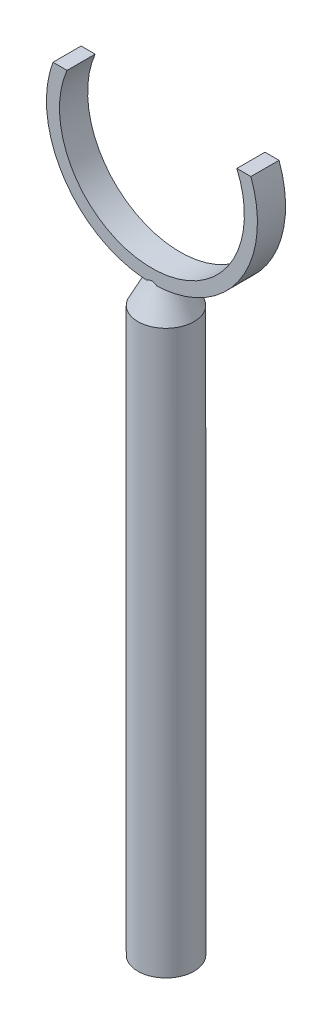
ISO-10303-21;
HEADER;
FILE_DESCRIPTION(('STEP AP214'),'2;1');
FILE_NAME('part.step','',(''),(''),'','','');
FILE_SCHEMA(('AUTOMOTIVE_DESIGN { 1 0 10303 214 1 1 1 1 }'));
ENDSEC;
DATA;
#1=APPLICATION_CONTEXT('core data for automotive mechanical design processes');
#2=APPLICATION_PROTOCOL_DEFINITION('international standard','automotive_design',2000,#1);
#3=PRODUCT_CONTEXT('',#1,'mechanical');
#4=PRODUCT('Part','Part','',(#3));
#5=PRODUCT_RELATED_PRODUCT_CATEGORY('part','',(#4));
#6=PRODUCT_DEFINITION_FORMATION('','',#4);
#7=PRODUCT_DEFINITION_CONTEXT('part definition',#1,'design');
#8=PRODUCT_DEFINITION('design','',#6,#7);
#9=PRODUCT_DEFINITION_SHAPE('','',#8);
#10=(LENGTH_UNIT() NAMED_UNIT(*) SI_UNIT(.MILLI.,.METRE.));
#11=(NAMED_UNIT(*) PLANE_ANGLE_UNIT() SI_UNIT($,.RADIAN.));
#12=(NAMED_UNIT(*) SI_UNIT($,.STERADIAN.) SOLID_ANGLE_UNIT());
#13=UNCERTAINTY_MEASURE_WITH_UNIT(LENGTH_MEASURE(1.E-05),#10,'distance_accuracy_value','');
#14=(GEOMETRIC_REPRESENTATION_CONTEXT(3) GLOBAL_UNCERTAINTY_ASSIGNED_CONTEXT((#13)) GLOBAL_UNIT_ASSIGNED_CONTEXT((#10,
#11,#12)) REPRESENTATION_CONTEXT('',''));
#15=CARTESIAN_POINT('',(0.,0.,0.));
#16=DIRECTION('',(0.,0.,1.));
#17=DIRECTION('',(1.,0.,0.));
#18=AXIS2_PLACEMENT_3D('',#15,#16,#17);
#19=CARTESIAN_POINT('',(0.,246.762097191876,4.99999999999999));
#20=DIRECTION('',(0.,0.,-1.));
#21=DIRECTION('',(-1.,0.,0.));
#22=AXIS2_PLACEMENT_3D('',#19,#20,#21);
#23=CYLINDRICAL_SURFACE('',#22,32.8552966657521);
#24=DIRECTION('',(0.,0.,-1.));
#25=VECTOR('',#24,1.);
#26=CARTESIAN_POINT('',(30.1800492165906,259.748056851399,4.99999999999999));
#27=LINE('',#26,#25);
#28=CARTESIAN_POINT('',(30.1800492165906,259.748056851399,4.99999999999999));
#29=VERTEX_POINT('',#28);
#30=CARTESIAN_POINT('',(30.1800492165906,259.748056851399,-4.99999999999999));
#31=VERTEX_POINT('',#30);
#32=EDGE_CURVE('E56',#29,#31,#27,.T.);
#33=ORIENTED_EDGE('',*,*,#32,.T.);
#34=CARTESIAN_POINT('',(0.,246.762097191876,-4.99999999999999));
#35=DIRECTION('',(0.,0.,1.));
#36=DIRECTION('',(1.,0.,0.));
#37=AXIS2_PLACEMENT_3D('',#34,#35,#36);
#38=CIRCLE('',#37,32.8552966657521);
#39=CARTESIAN_POINT('',(-30.1800492165906,259.748056851399,-4.99999999999999));
#40=VERTEX_POINT('',#39);
#41=EDGE_CURVE('E93',#40,#31,#38,.T.);
#42=ORIENTED_EDGE('',*,*,#41,.F.);
#43=DIRECTION('',(0.,0.,-1.));
#44=VECTOR('',#43,1.);
#45=CARTESIAN_POINT('',(-30.1800492165906,259.748056851399,4.99999999999999));
#46=LINE('',#45,#44);
#47=CARTESIAN_POINT('',(-30.1800492165906,259.748056851399,4.99999999999999));
#48=VERTEX_POINT('',#47);
#49=EDGE_CURVE('E13',#48,#40,#46,.T.);
#50=ORIENTED_EDGE('',*,*,#49,.F.);
#51=CARTESIAN_POINT('',(0.,246.762097191876,4.99999999999999));
#52=DIRECTION('',(0.,0.,1.));
#53=DIRECTION('',(1.,0.,0.));
#54=AXIS2_PLACEMENT_3D('',#51,#52,#53);
#55=CIRCLE('',#54,32.8552966657521);
#56=EDGE_CURVE('E94',#48,#29,#55,.T.);
#57=ORIENTED_EDGE('',*,*,#56,.T.);
#58=EDGE_LOOP('',(#33,#42,#50,#57));
#59=FACE_BOUND('',#58,.T.);
#60=ADVANCED_FACE('F53',(#59),#23,.F.);
#61=CARTESIAN_POINT('',(-35.1800492165906,259.748056851399,4.99999999999999));
#62=DIRECTION('',(0.,1.,0.));
#63=DIRECTION('',(0.,0.,1.));
#64=AXIS2_PLACEMENT_3D('',#61,#62,#63);
#65=PLANE('',#64);
#66=ORIENTED_EDGE('',*,*,#49,.T.);
#67=DIRECTION('',(1.,0.,0.));
#68=VECTOR('',#67,1.);
#69=CARTESIAN_POINT('',(-35.1800492165906,259.748056851399,-4.99999999999999));
#70=LINE('',#69,#68);
#71=CARTESIAN_POINT('',(-35.1800492165906,259.748056851399,-4.99999999999999));
#72=VERTEX_POINT('',#71);
#73=EDGE_CURVE('E111',#72,#40,#70,.T.);
#74=ORIENTED_EDGE('',*,*,#73,.F.);
#75=DIRECTION('',(0.,0.,-1.));
#76=VECTOR('',#75,1.);
#77=CARTESIAN_POINT('',(-35.1800492165906,259.748056851399,4.99999999999999));
#78=LINE('',#77,#76);
#79=CARTESIAN_POINT('',(-35.1800492165906,259.748056851399,4.99999999999999));
#80=VERTEX_POINT('',#79);
#81=EDGE_CURVE('E61',#80,#72,#78,.T.);
#82=ORIENTED_EDGE('',*,*,#81,.F.);
#83=DIRECTION('',(1.,0.,0.));
#84=VECTOR('',#83,1.);
#85=CARTESIAN_POINT('',(-35.1800492165906,259.748056851399,4.99999999999999));
#86=LINE('',#85,#84);
#87=EDGE_CURVE('E99',#80,#48,#86,.T.);
#88=ORIENTED_EDGE('',*,*,#87,.T.);
#89=EDGE_LOOP('',(#66,#74,#82,#88));
#90=FACE_BOUND('',#89,.T.);
#91=ADVANCED_FACE('F125',(#90),#65,.T.);
#92=CARTESIAN_POINT('',(0.,246.762097191876,4.99999999999999));
#93=DIRECTION('',(0.,0.,-1.));
#94=DIRECTION('',(-1.,0.,0.));
#95=AXIS2_PLACEMENT_3D('',#92,#93,#94);
#96=CYLINDRICAL_SURFACE('',#95,37.5002801477601);
#97=ORIENTED_EDGE('',*,*,#81,.T.);
#98=CARTESIAN_POINT('',(0.,246.762097191876,-4.99999999999999));
#99=DIRECTION('',(0.,0.,1.));
#100=DIRECTION('',(1.,0.,0.));
#101=AXIS2_PLACEMENT_3D('',#98,#99,#100);
#102=CIRCLE('',#101,37.5002801477601);
#103=CARTESIAN_POINT('',(35.1800492165906,259.748056851399,-4.99999999999999));
#104=VERTEX_POINT('',#103);
#105=EDGE_CURVE('E107',#72,#104,#102,.T.);
#106=ORIENTED_EDGE('',*,*,#105,.T.);
#107=DIRECTION('',(0.,0.,-1.));
#108=VECTOR('',#107,1.);
#109=CARTESIAN_POINT('',(35.1800492165906,259.748056851399,4.99999999999999));
#110=LINE('',#109,#108);
#111=CARTESIAN_POINT('',(35.1800492165906,259.748056851399,4.99999999999999));
#112=VERTEX_POINT('',#111);
#113=EDGE_CURVE('E98',#112,#104,#110,.T.);
#114=ORIENTED_EDGE('',*,*,#113,.F.);
#115=CARTESIAN_POINT('',(0.,246.762097191876,4.99999999999999));
#116=DIRECTION('',(0.,0.,1.));
#117=DIRECTION('',(1.,0.,0.));
#118=AXIS2_PLACEMENT_3D('',#115,#116,#117);
#119=CIRCLE('',#118,37.5002801477601);
#120=EDGE_CURVE('E119',#80,#112,#119,.T.);
#121=ORIENTED_EDGE('',*,*,#120,.F.);
#122=EDGE_LOOP('',(#97,#106,#114,#121));
#123=FACE_BOUND('',#122,.T.);
#124=ADVANCED_FACE('F123',(#123),#96,.T.);
#125=CARTESIAN_POINT('',(30.1800492165906,259.748056851399,4.99999999999999));
#126=DIRECTION('',(0.,1.,0.));
#127=DIRECTION('',(0.,0.,1.));
#128=AXIS2_PLACEMENT_3D('',#125,#126,#127);
#129=PLANE('',#128);
#130=ORIENTED_EDGE('',*,*,#113,.T.);
#131=DIRECTION('',(1.,0.,0.));
#132=VECTOR('',#131,1.);
#133=CARTESIAN_POINT('',(30.1800492165906,259.748056851399,-4.99999999999999));
#134=LINE('',#133,#132);
#135=EDGE_CURVE('E101',#31,#104,#134,.T.);
#136=ORIENTED_EDGE('',*,*,#135,.F.);
#137=ORIENTED_EDGE('',*,*,#32,.F.);
#138=DIRECTION('',(1.,0.,0.));
#139=VECTOR('',#138,1.);
#140=CARTESIAN_POINT('',(30.1800492165906,259.748056851399,4.99999999999999));
#141=LINE('',#140,#139);
#142=EDGE_CURVE('E117',#29,#112,#141,.T.);
#143=ORIENTED_EDGE('',*,*,#142,.T.);
#144=EDGE_LOOP('',(#130,#136,#137,#143));
#145=FACE_BOUND('',#144,.T.);
#146=ADVANCED_FACE('F102',(#145),#129,.T.);
#147=CARTESIAN_POINT('',(0.,246.762097191876,4.99999999999999));
#148=DIRECTION('',(0.,0.,1.));
#149=DIRECTION('',(1.,0.,0.));
#150=AXIS2_PLACEMENT_3D('',#147,#148,#149);
#151=PLANE('',#150);
#152=ORIENTED_EDGE('',*,*,#56,.F.);
#153=ORIENTED_EDGE('',*,*,#87,.F.);
#154=ORIENTED_EDGE('',*,*,#120,.T.);
#155=ORIENTED_EDGE('',*,*,#142,.F.);
#156=EDGE_LOOP('',(#152,#153,#154,#155));
#157=FACE_BOUND('',#156,.T.);
#158=ADVANCED_FACE('F127',(#157),#151,.T.);
#159=CARTESIAN_POINT('',(0.,246.762097191876,-4.99999999999999));
#160=DIRECTION('',(0.,0.,1.));
#161=DIRECTION('',(1.,0.,0.));
#162=AXIS2_PLACEMENT_3D('',#159,#160,#161);
#163=PLANE('',#162);
#164=ORIENTED_EDGE('',*,*,#41,.T.);
#165=ORIENTED_EDGE('',*,*,#135,.T.);
#166=ORIENTED_EDGE('',*,*,#105,.F.);
#167=ORIENTED_EDGE('',*,*,#73,.T.);
#168=EDGE_LOOP('',(#164,#165,#166,#167));
#169=FACE_BOUND('',#168,.T.);
#170=ADVANCED_FACE('F110',(#169),#163,.F.);
#171=CLOSED_SHELL('',(#60,#91,#124,#146,#158,#170));
#172=MANIFOLD_SOLID_BREP('B2',#171);
#173=CARTESIAN_POINT('',(0.,200.,0.));
#174=DIRECTION('',(0.,-1.,0.));
#175=DIRECTION('',(0.,0.,-1.));
#176=AXIS2_PLACEMENT_3D('',#173,#174,#175);
#177=CYLINDRICAL_SURFACE('',#176,10.);
#178=CARTESIAN_POINT('',(0.,200.,0.));
#179=DIRECTION('',(0.,-1.,0.));
#180=DIRECTION('',(0.,0.,-1.));
#181=AXIS2_PLACEMENT_3D('',#178,#179,#180);
#182=CIRCLE('',#181,10.);
#183=CARTESIAN_POINT('',(0.941083133185143,200.,9.9556196460308));
#184=VERTEX_POINT('',#183);
#185=EDGE_CURVE('E52',#184,#184,#182,.F.);
#186=ORIENTED_EDGE('',*,*,#185,.F.);
#187=EDGE_LOOP('',(#186));
#188=FACE_BOUND('',#187,.T.);
#189=CARTESIAN_POINT('',(0.,0.,0.));
#190=DIRECTION('',(0.,1.,0.));
#191=DIRECTION('',(0.,0.,1.));
#192=AXIS2_PLACEMENT_3D('',#189,#190,#191);
#193=CIRCLE('',#192,10.);
#194=CARTESIAN_POINT('',(0.,0.,10.));
#195=VERTEX_POINT('',#194);
#196=EDGE_CURVE('E196',#195,#195,#193,.T.);
#197=ORIENTED_EDGE('',*,*,#196,.T.);
#198=EDGE_LOOP('',(#197));
#199=FACE_BOUND('',#198,.T.);
#200=ADVANCED_FACE('F189',(#188,#199),#177,.T.);
#201=CARTESIAN_POINT('',(0.,0.,0.));
#202=DIRECTION('',(0.,1.,0.));
#203=DIRECTION('',(0.,0.,1.));
#204=AXIS2_PLACEMENT_3D('',#201,#202,#203);
#205=PLANE('',#204);
#206=ORIENTED_EDGE('',*,*,#196,.F.);
#207=EDGE_LOOP('',(#206));
#208=FACE_BOUND('',#207,.T.);
#209=ADVANCED_FACE('F222',(#208),#205,.F.);
#210=CARTESIAN_POINT('',(0.,210.,0.));
#211=DIRECTION('',(0.,1.,0.));
#212=DIRECTION('',(0.,0.,1.));
#213=AXIS2_PLACEMENT_3D('',#210,#211,#212);
#214=PLANE('',#213);
#215=CARTESIAN_POINT('',(0.,210.,0.));
#216=DIRECTION('',(0.,1.,0.));
#217=DIRECTION('',(0.,0.,1.));
#218=AXIS2_PLACEMENT_3D('',#215,#216,#217);
#219=CIRCLE('',#218,5.);
#220=CARTESIAN_POINT('',(1.84646326654365,210.,4.64656576465942));
#221=VERTEX_POINT('',#220);
#222=EDGE_CURVE('E200',#221,#221,#219,.T.);
#223=ORIENTED_EDGE('',*,*,#222,.T.);
#224=EDGE_LOOP('',(#223));
#225=FACE_BOUND('',#224,.T.);
#226=ADVANCED_FACE('F212',(#225),#214,.T.);
#227=CARTESIAN_POINT('',(0.941083133185143,200.,9.9556196460308));
#228=CARTESIAN_POINT('',(1.84646326654365,210.,4.64656576465942));
#229=CARTESIAN_POINT('',(20.8523224252467,200.,8.07345337966052));
#230=CARTESIAN_POINT('',(11.1395947958625,210.,0.953639231572114));
#231=CARTESIAN_POINT('',(18.9701561588765,200.,-11.8377859124011));
#232=CARTESIAN_POINT('',(7.44666826277518,210.,-8.33949229774672));
#233=CARTESIAN_POINT('',(-0.941083133185141,200.,-9.9556196460308));
#234=CARTESIAN_POINT('',(-1.84646326654365,210.,-4.64656576465942));
#235=CARTESIAN_POINT('',(-20.8523224252468,200.,-8.07345337966052));
#236=CARTESIAN_POINT('',(-11.1395947958625,210.,-0.953639231572117));
#237=CARTESIAN_POINT('',(-18.9701561588765,200.,11.8377859124011));
#238=CARTESIAN_POINT('',(-7.44666826277518,210.,8.33949229774672));
#239=CARTESIAN_POINT('',(0.941083133185143,200.,9.9556196460308));
#240=CARTESIAN_POINT('',(1.84646326654365,210.,4.64656576465942));
#241=(BOUNDED_SURFACE() B_SPLINE_SURFACE(3,1,((#227,#228),(#229,#230),(#231,#232),(#233,#234),
(#235,#236),(#237,#238),(#239,#240)),.UNSPECIFIED.,.T.,.F.,.F.) B_SPLINE_SURFACE_WITH_KNOTS((4,
3,4),(2,2),(0.,0.5,1.),(0.,1.),
.UNSPECIFIED.) GEOMETRIC_REPRESENTATION_ITEM() RATIONAL_B_SPLINE_SURFACE(((1.,1.),
(0.333333333333333,0.333333333333333),(0.333333333333333,0.333333333333333),(1.,1.),
(0.333333333333333,0.333333333333333),(0.333333333333333,0.333333333333333),(1.,1.))) REPRESENTATION_ITEM('') SURFACE());
#242=CARTESIAN_POINT('',(0.941083133185143,200.,9.9556196460308));
#243=CARTESIAN_POINT('',(0.950514176240961,200.104166666667,9.90031700143318));
#244=CARTESIAN_POINT('',(0.959945219296779,200.208333333333,9.84501435683556));
#245=CARTESIAN_POINT('',(0.978807305408414,200.416666666667,9.73440906764033));
#246=CARTESIAN_POINT('',(0.988238348464232,200.520833333333,9.67910642304271));
#247=CARTESIAN_POINT('',(1.00710043457587,200.729166666667,9.56850113384747));
#248=CARTESIAN_POINT('',(1.01653147763169,200.833333333333,9.51319848924985));
#249=CARTESIAN_POINT('',(1.03539356374332,201.041666666667,9.40259320005461));
#250=CARTESIAN_POINT('',(1.04482460679914,201.145833333333,9.347290555457));
#251=CARTESIAN_POINT('',(1.06368669291077,201.354166666667,9.23668526626176));
#252=CARTESIAN_POINT('',(1.07311773596659,201.458333333333,9.18138262166414));
#253=CARTESIAN_POINT('',(1.09197982207823,201.666666666667,9.0707773324689));
#254=CARTESIAN_POINT('',(1.10141086513405,201.770833333333,9.01547468787128));
#255=CARTESIAN_POINT('',(1.12027295124568,201.979166666667,8.90486939867605));
#256=CARTESIAN_POINT('',(1.1297039943015,202.083333333333,8.84956675407843));
#257=CARTESIAN_POINT('',(1.14856608041313,202.291666666667,8.73896146488319));
#258=CARTESIAN_POINT('',(1.15799712346895,202.395833333333,8.68365882028557));
#259=CARTESIAN_POINT('',(1.17685920958059,202.604166666667,8.57305353109033));
#260=CARTESIAN_POINT('',(1.18629025263641,202.708333333333,8.51775088649271));
#261=CARTESIAN_POINT('',(1.20515233874804,202.916666666667,8.40714559729748));
#262=CARTESIAN_POINT('',(1.21458338180386,203.020833333333,8.35184295269986));
#263=CARTESIAN_POINT('',(1.23344546791549,203.229166666667,8.24123766350463));
#264=CARTESIAN_POINT('',(1.24287651097131,203.333333333333,8.18593501890701));
#265=CARTESIAN_POINT('',(1.26173859708295,203.541666666667,8.07532972971177));
#266=CARTESIAN_POINT('',(1.27116964013877,203.645833333333,8.02002708511415));
#267=CARTESIAN_POINT('',(1.2900317262504,203.854166666667,7.90942179591891));
#268=CARTESIAN_POINT('',(1.29946276930622,203.958333333333,7.8541191513213));
#269=CARTESIAN_POINT('',(1.31832485541786,204.166666666667,7.74351386212606));
#270=CARTESIAN_POINT('',(1.32775589847367,204.270833333333,7.68821121752844));
#271=CARTESIAN_POINT('',(1.34661798458531,204.479166666667,7.5776059283332));
#272=CARTESIAN_POINT('',(1.35604902764113,204.583333333333,7.52230328373558));
#273=CARTESIAN_POINT('',(1.37491111375276,204.791666666667,7.41169799454035));
#274=CARTESIAN_POINT('',(1.38434215680858,204.895833333333,7.35639534994273));
#275=CARTESIAN_POINT('',(1.40320424292022,205.104166666667,7.24579006074749));
#276=CARTESIAN_POINT('',(1.41263528597603,205.208333333333,7.19048741614987));
#277=CARTESIAN_POINT('',(1.43149737208767,205.416666666667,7.07988212695463));
#278=CARTESIAN_POINT('',(1.44092841514349,205.520833333333,7.02457948235702));
#279=CARTESIAN_POINT('',(1.45979050125512,205.729166666667,6.91397419316178));
#280=CARTESIAN_POINT('',(1.46922154431094,205.833333333333,6.85867154856416));
#281=CARTESIAN_POINT('',(1.48808363042258,206.041666666667,6.74806625936892));
#282=CARTESIAN_POINT('',(1.49751467347839,206.145833333333,6.6927636147713));
#283=CARTESIAN_POINT('',(1.51637675959003,206.354166666667,6.58215832557607));
#284=CARTESIAN_POINT('',(1.52580780264585,206.458333333333,6.52685568097845));
#285=CARTESIAN_POINT('',(1.54466988875748,206.666666666667,6.41625039178321));
#286=CARTESIAN_POINT('',(1.5541009318133,206.770833333333,6.36094774718559));
#287=CARTESIAN_POINT('',(1.57296301792494,206.979166666667,6.25034245799035));
#288=CARTESIAN_POINT('',(1.58239406098075,207.083333333333,6.19503981339273));
#289=CARTESIAN_POINT('',(1.60125614709239,207.291666666667,6.0844345241975));
#290=CARTESIAN_POINT('',(1.61068719014821,207.395833333333,6.02913187959988));
#291=CARTESIAN_POINT('',(1.62954927625984,207.604166666667,5.91852659040465));
#292=CARTESIAN_POINT('',(1.63898031931566,207.708333333333,5.86322394580703));
#293=CARTESIAN_POINT('',(1.6578424054273,207.916666666667,5.75261865661179));
#294=CARTESIAN_POINT('',(1.66727344848311,208.020833333333,5.69731601201417));
#295=CARTESIAN_POINT('',(1.68613553459475,208.229166666667,5.58671072281893));
#296=CARTESIAN_POINT('',(1.69556657765057,208.333333333333,5.53140807822132));
#297=CARTESIAN_POINT('',(1.7144286637622,208.541666666667,5.42080278902608));
#298=CARTESIAN_POINT('',(1.72385970681802,208.645833333333,5.36550014442846));
#299=CARTESIAN_POINT('',(1.74272179292966,208.854166666667,5.25489485523322));
#300=CARTESIAN_POINT('',(1.75215283598547,208.958333333333,5.1995922106356));
#301=CARTESIAN_POINT('',(1.77101492209711,209.166666666667,5.08898692144036));
#302=CARTESIAN_POINT('',(1.78044596515293,209.270833333333,5.03368427684275));
#303=CARTESIAN_POINT('',(1.79930805126456,209.479166666667,4.92307898764751));
#304=CARTESIAN_POINT('',(1.80873909432038,209.583333333333,4.86777634304989));
#305=CARTESIAN_POINT('',(1.82760118043202,209.791666666667,4.75717105385465));
#306=CARTESIAN_POINT('',(1.83703222348783,209.895833333333,4.70186840925703));
#307=CARTESIAN_POINT('',(1.84646326654365,210.,4.64656576465942));
#308=B_SPLINE_CURVE_WITH_KNOTS('',3,(#242,#243,#244,#245,#246,#247,#248,#249,#250,#251,#252,
#253,#254,#255,#256,#257,#258,#259,#260,#261,#262,#263,#264,#265,#266,#267,#268,#269,#270,#271,
#272,#273,#274,#275,#276,#277,#278,#279,#280,#281,#282,#283,#284,#285,#286,#287,#288,#289,#290,
#291,#292,#293,#294,#295,#296,#297,#298,#299,#300,#301,#302,#303,#304,#305,#306,#307),
.UNSPECIFIED.,.F.,.F.,(4,2,2,2,2,2,2,2,2,2,2,2,2,2,2,2,2,2,2,2,2,2,2,2,2,2,2,2,2,2,2,2,4),(0.,
0.35493970425059,0.709879408501181,1.06481911275177,1.41975881700239,1.77469852125298,
2.12963822550357,2.48457792975418,2.83951763400477,3.19445733825536,3.54939704250598,
3.90433674675657,4.25927645100716,4.61421615525775,4.96915585950834,5.32409556375895,
5.67903526800955,6.03397497226014,6.38891467651075,6.74385438076134,7.09879408501193,
7.45373378926252,7.80867349351311,8.1636131977637,8.51855290201432,8.87349260626491,
9.2284323105155,9.58337201476611,9.9383117190167,10.2932514232673,10.6481911275179,
11.0031308317685,11.3580705360191),.UNSPECIFIED.);
#309=EDGE_CURVE('BSEAM221',#184,#221,#308,.T.);
#310=ORIENTED_EDGE('',*,*,#185,.T.);
#311=ORIENTED_EDGE('',*,*,#222,.F.);
#312=ORIENTED_EDGE('',*,*,#309,.T.);
#313=ORIENTED_EDGE('',*,*,#309,.F.);
#314=EDGE_LOOP('',(#310,#312,#311,#313));
#315=FACE_BOUND('',#314,.T.);
#316=ADVANCED_FACE('F221',(#315),#241,.T.);
#317=CLOSED_SHELL('',(#200,#209,#226,#316));
#318=MANIFOLD_SOLID_BREP('B7',#317);
#319=ADVANCED_BREP_SHAPE_REPRESENTATION('',(#18,#172,#318),#14);
#320=SHAPE_DEFINITION_REPRESENTATION(#9,#319);
ENDSEC;
END-ISO-10303-21;
